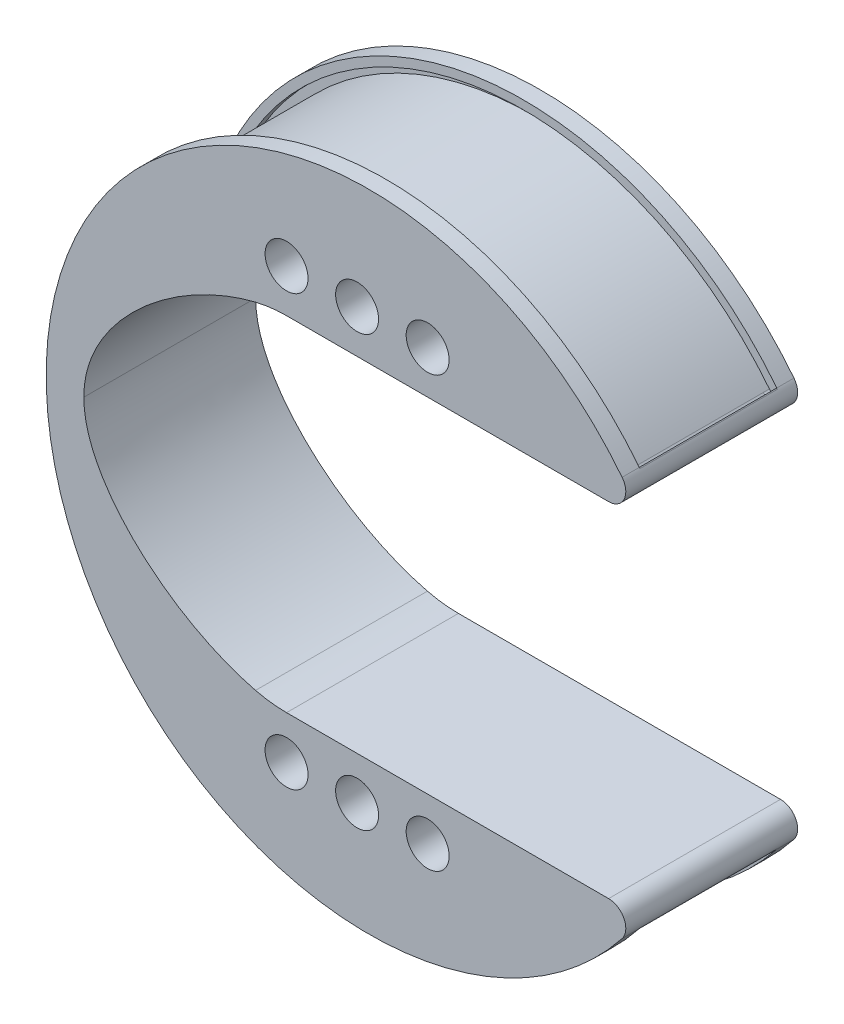
ISO-10303-21;
HEADER;
FILE_DESCRIPTION(('STEP AP214'),'2;1');
FILE_NAME('part.step','',(''),(''),'','','');
FILE_SCHEMA(('AUTOMOTIVE_DESIGN { 1 0 10303 214 1 1 1 1 }'));
ENDSEC;
DATA;
#1=APPLICATION_CONTEXT('core data for automotive mechanical design processes');
#2=APPLICATION_PROTOCOL_DEFINITION('international standard','automotive_design',2000,#1);
#3=PRODUCT_CONTEXT('',#1,'mechanical');
#4=PRODUCT('Part','Part','',(#3));
#5=PRODUCT_RELATED_PRODUCT_CATEGORY('part','',(#4));
#6=PRODUCT_DEFINITION_FORMATION('','',#4);
#7=PRODUCT_DEFINITION_CONTEXT('part definition',#1,'design');
#8=PRODUCT_DEFINITION('design','',#6,#7);
#9=PRODUCT_DEFINITION_SHAPE('','',#8);
#10=(LENGTH_UNIT() NAMED_UNIT(*) SI_UNIT(.MILLI.,.METRE.));
#11=(NAMED_UNIT(*) PLANE_ANGLE_UNIT() SI_UNIT($,.RADIAN.));
#12=(NAMED_UNIT(*) SI_UNIT($,.STERADIAN.) SOLID_ANGLE_UNIT());
#13=UNCERTAINTY_MEASURE_WITH_UNIT(LENGTH_MEASURE(1.E-05),#10,'distance_accuracy_value','');
#14=(GEOMETRIC_REPRESENTATION_CONTEXT(3) GLOBAL_UNCERTAINTY_ASSIGNED_CONTEXT((#13)) GLOBAL_UNIT_ASSIGNED_CONTEXT((#10,
#11,#12)) REPRESENTATION_CONTEXT('',''));
#15=CARTESIAN_POINT('',(0.,0.,0.));
#16=DIRECTION('',(0.,0.,1.));
#17=DIRECTION('',(1.,0.,0.));
#18=AXIS2_PLACEMENT_3D('',#15,#16,#17);
#19=CARTESIAN_POINT('',(33.1482051209383,0.,0.));
#20=DIRECTION('',(0.,0.,1.));
#21=DIRECTION('',(1.,0.,0.));
#22=AXIS2_PLACEMENT_3D('',#19,#20,#21);
#23=CYLINDRICAL_SURFACE('',#22,37.5360003662905);
#24=CARTESIAN_POINT('',(33.1482051209383,0.,2.));
#25=DIRECTION('',(0.,0.,1.));
#26=DIRECTION('',(1.,0.,0.));
#27=AXIS2_PLACEMENT_3D('',#24,#25,#26);
#28=CIRCLE('',#27,37.5360003662905);
#29=CARTESIAN_POINT('',(62.6259639896768,23.2381809867871,2.));
#30=VERTEX_POINT('',#29);
#31=CARTESIAN_POINT('',(62.6259639896767,-23.2381809867871,2.));
#32=VERTEX_POINT('',#31);
#33=EDGE_CURVE('E261',#30,#32,#28,.T.);
#34=ORIENTED_EDGE('',*,*,#33,.F.);
#35=DIRECTION('',(0.,0.,1.));
#36=VECTOR('',#35,1.);
#37=CARTESIAN_POINT('',(62.6259639896768,23.2381809867871,0.));
#38=LINE('',#37,#36);
#39=CARTESIAN_POINT('',(62.6259639896768,23.2381809867871,0.));
#40=VERTEX_POINT('',#39);
#41=EDGE_CURVE('E466',#30,#40,#38,.F.);
#42=ORIENTED_EDGE('',*,*,#41,.T.);
#43=CARTESIAN_POINT('',(33.1482051209383,0.,0.));
#44=DIRECTION('',(0.,0.,1.));
#45=DIRECTION('',(1.,0.,0.));
#46=AXIS2_PLACEMENT_3D('',#43,#44,#45);
#47=CIRCLE('',#46,37.5360003662905);
#48=CARTESIAN_POINT('',(62.6259639896767,-23.2381809867871,0.));
#49=VERTEX_POINT('',#48);
#50=EDGE_CURVE('E286',#49,#40,#47,.F.);
#51=ORIENTED_EDGE('',*,*,#50,.F.);
#52=DIRECTION('',(0.,0.,1.));
#53=VECTOR('',#52,1.);
#54=CARTESIAN_POINT('',(62.6259639896767,-23.2381809867871,0.));
#55=LINE('',#54,#53);
#56=EDGE_CURVE('E471',#49,#32,#55,.T.);
#57=ORIENTED_EDGE('',*,*,#56,.T.);
#58=EDGE_LOOP('',(#34,#42,#51,#57));
#59=FACE_BOUND('',#58,.T.);
#60=ADVANCED_FACE('F77',(#59),#23,.T.);
#61=CARTESIAN_POINT('',(0.,0.,20.));
#62=CARTESIAN_POINT('',(-0.0933459762474879,-8.13219904614453,20.));
#63=CARTESIAN_POINT('',(9.98710230848334,-17.0850852007355,20.));
#64=CARTESIAN_POINT('',(19.9745764255448,-19.5597289191086,20.));
#65=B_SPLINE_CURVE_WITH_KNOTS('',3,(#61,#62,#63,#64),.UNSPECIFIED.,.F.,.F.,(4,4),(0.,1.),.UNSPECIFIED.);
#66=DIRECTION('',(0.,0.,-1.));
#67=VECTOR('',#66,1.);
#68=SURFACE_OF_LINEAR_EXTRUSION('',#65,#67);
#69=CARTESIAN_POINT('',(0.,0.,0.));
#70=CARTESIAN_POINT('',(-0.0933459762474879,-8.13219904614453,0.));
#71=CARTESIAN_POINT('',(9.98710230848334,-17.0850852007355,0.));
#72=CARTESIAN_POINT('',(19.9745764255448,-19.5597289191086,0.));
#73=B_SPLINE_CURVE_WITH_KNOTS('',3,(#69,#70,#71,#72),.UNSPECIFIED.,.F.,.F.,(4,4),(0.,1.),.UNSPECIFIED.);
#74=CARTESIAN_POINT('',(0.,0.,0.));
#75=VERTEX_POINT('',#74);
#76=CARTESIAN_POINT('',(19.9745764255448,-19.5597289191086,0.));
#77=VERTEX_POINT('',#76);
#78=EDGE_CURVE('E289',#75,#77,#73,.T.);
#79=ORIENTED_EDGE('',*,*,#78,.F.);
#80=DIRECTION('',(0.,0.,-1.));
#81=VECTOR('',#80,1.);
#82=CARTESIAN_POINT('',(0.,0.,20.));
#83=LINE('',#82,#81);
#84=CARTESIAN_POINT('',(0.,0.,20.));
#85=VERTEX_POINT('',#84);
#86=EDGE_CURVE('E446',#85,#75,#83,.T.);
#87=ORIENTED_EDGE('',*,*,#86,.F.);
#88=CARTESIAN_POINT('',(19.9745764255448,-19.5597289191086,20.));
#89=VERTEX_POINT('',#88);
#90=EDGE_CURVE('E292',#85,#89,#65,.T.);
#91=ORIENTED_EDGE('',*,*,#90,.T.);
#92=DIRECTION('',(0.,0.,-1.));
#93=VECTOR('',#92,1.);
#94=CARTESIAN_POINT('',(19.9745764255448,-19.5597289191086,20.));
#95=LINE('',#94,#93);
#96=EDGE_CURVE('E441',#89,#77,#95,.T.);
#97=ORIENTED_EDGE('',*,*,#96,.T.);
#98=EDGE_LOOP('',(#79,#87,#91,#97));
#99=FACE_BOUND('',#98,.T.);
#100=ADVANCED_FACE('F308',(#99),#68,.T.);
#101=CARTESIAN_POINT('',(0.,0.,20.));
#102=CARTESIAN_POINT('',(-0.0933459762474879,8.13219904614453,20.));
#103=CARTESIAN_POINT('',(9.98710230848334,17.0850852007355,20.));
#104=CARTESIAN_POINT('',(19.9745764255448,19.5597289191086,20.));
#105=B_SPLINE_CURVE_WITH_KNOTS('',3,(#101,#102,#103,#104),.UNSPECIFIED.,.F.,.F.,(4,4),(0.,1.),.UNSPECIFIED.);
#106=DIRECTION('',(0.,0.,-1.));
#107=VECTOR('',#106,1.);
#108=SURFACE_OF_LINEAR_EXTRUSION('',#105,#107);
#109=CARTESIAN_POINT('',(0.,0.,0.));
#110=CARTESIAN_POINT('',(-0.0933459762474879,8.13219904614453,0.));
#111=CARTESIAN_POINT('',(9.98710230848334,17.0850852007355,0.));
#112=CARTESIAN_POINT('',(19.9745764255448,19.5597289191086,0.));
#113=B_SPLINE_CURVE_WITH_KNOTS('',3,(#109,#110,#111,#112),.UNSPECIFIED.,.F.,.F.,(4,4),(0.,1.),.UNSPECIFIED.);
#114=CARTESIAN_POINT('',(19.9745764255448,19.5597289191086,0.));
#115=VERTEX_POINT('',#114);
#116=EDGE_CURVE('E422',#75,#115,#113,.T.);
#117=ORIENTED_EDGE('',*,*,#116,.T.);
#118=DIRECTION('',(0.,0.,-1.));
#119=VECTOR('',#118,1.);
#120=CARTESIAN_POINT('',(19.9745764255448,19.5597289191086,20.));
#121=LINE('',#120,#119);
#122=CARTESIAN_POINT('',(19.9745764255448,19.5597289191086,20.));
#123=VERTEX_POINT('',#122);
#124=EDGE_CURVE('E418',#123,#115,#121,.T.);
#125=ORIENTED_EDGE('',*,*,#124,.F.);
#126=EDGE_CURVE('E298',#85,#123,#105,.T.);
#127=ORIENTED_EDGE('',*,*,#126,.F.);
#128=ORIENTED_EDGE('',*,*,#86,.T.);
#129=EDGE_LOOP('',(#117,#125,#127,#128));
#130=FACE_BOUND('',#129,.T.);
#131=ADVANCED_FACE('F311',(#130),#108,.F.);
#132=CARTESIAN_POINT('',(23.5821093501447,5.,20.));
#133=DIRECTION('',(0.,0.,-1.));
#134=DIRECTION('',(-1.,0.,0.));
#135=AXIS2_PLACEMENT_3D('',#132,#133,#134);
#136=CYLINDRICAL_SURFACE('',#135,15.);
#137=CARTESIAN_POINT('',(23.5821093501447,5.,0.));
#138=DIRECTION('',(0.,0.,1.));
#139=DIRECTION('',(1.,0.,0.));
#140=AXIS2_PLACEMENT_3D('',#137,#138,#139);
#141=CIRCLE('',#140,15.);
#142=CARTESIAN_POINT('',(23.5821093501447,20.,0.));
#143=VERTEX_POINT('',#142);
#144=EDGE_CURVE('E412',#115,#143,#141,.F.);
#145=ORIENTED_EDGE('',*,*,#144,.T.);
#146=DIRECTION('',(0.,0.,-1.));
#147=VECTOR('',#146,1.);
#148=CARTESIAN_POINT('',(23.5821093501447,20.,20.));
#149=LINE('',#148,#147);
#150=CARTESIAN_POINT('',(23.5821093501447,20.,20.));
#151=VERTEX_POINT('',#150);
#152=EDGE_CURVE('E415',#151,#143,#149,.T.);
#153=ORIENTED_EDGE('',*,*,#152,.F.);
#154=CARTESIAN_POINT('',(23.5821093501447,5.,20.));
#155=DIRECTION('',(0.,0.,1.));
#156=DIRECTION('',(1.,0.,0.));
#157=AXIS2_PLACEMENT_3D('',#154,#155,#156);
#158=CIRCLE('',#157,15.);
#159=EDGE_CURVE('E508',#123,#151,#158,.F.);
#160=ORIENTED_EDGE('',*,*,#159,.F.);
#161=ORIENTED_EDGE('',*,*,#124,.T.);
#162=EDGE_LOOP('',(#145,#153,#160,#161));
#163=FACE_BOUND('',#162,.T.);
#164=ADVANCED_FACE('F401',(#163),#136,.F.);
#165=CARTESIAN_POINT('',(0.,20.,20.));
#166=DIRECTION('',(0.,1.,0.));
#167=DIRECTION('',(0.,0.,1.));
#168=AXIS2_PLACEMENT_3D('',#165,#166,#167);
#169=PLANE('',#168);
#170=DIRECTION('',(1.,0.,0.));
#171=VECTOR('',#170,1.);
#172=CARTESIAN_POINT('',(0.,20.,0.));
#173=LINE('',#172,#171);
#174=CARTESIAN_POINT('',(61.0553246790905,20.,0.));
#175=VERTEX_POINT('',#174);
#176=EDGE_CURVE('E421',#143,#175,#173,.T.);
#177=ORIENTED_EDGE('',*,*,#176,.T.);
#178=DIRECTION('',(0.,0.,1.));
#179=VECTOR('',#178,1.);
#180=CARTESIAN_POINT('',(61.0553246790905,20.,20.));
#181=LINE('',#180,#179);
#182=CARTESIAN_POINT('',(61.0553246790905,20.,20.));
#183=VERTEX_POINT('',#182);
#184=EDGE_CURVE('E483',#175,#183,#181,.T.);
#185=ORIENTED_EDGE('',*,*,#184,.T.);
#186=DIRECTION('',(1.,0.,0.));
#187=VECTOR('',#186,1.);
#188=CARTESIAN_POINT('',(0.,20.,20.));
#189=LINE('',#188,#187);
#190=EDGE_CURVE('E428',#151,#183,#189,.T.);
#191=ORIENTED_EDGE('',*,*,#190,.F.);
#192=ORIENTED_EDGE('',*,*,#152,.T.);
#193=EDGE_LOOP('',(#177,#185,#191,#192));
#194=FACE_BOUND('',#193,.T.);
#195=ADVANCED_FACE('F398',(#194),#169,.F.);
#196=CARTESIAN_POINT('',(0.,-20.,20.));
#197=DIRECTION('',(0.,1.,0.));
#198=DIRECTION('',(0.,0.,1.));
#199=AXIS2_PLACEMENT_3D('',#196,#197,#198);
#200=PLANE('',#199);
#201=DIRECTION('',(1.,0.,0.));
#202=VECTOR('',#201,1.);
#203=CARTESIAN_POINT('',(0.,-20.,20.));
#204=LINE('',#203,#202);
#205=CARTESIAN_POINT('',(23.5821093501447,-20.,20.));
#206=VERTEX_POINT('',#205);
#207=CARTESIAN_POINT('',(61.0553246790905,-20.,20.));
#208=VERTEX_POINT('',#207);
#209=EDGE_CURVE('E509',#206,#208,#204,.T.);
#210=ORIENTED_EDGE('',*,*,#209,.T.);
#211=DIRECTION('',(0.,0.,-1.));
#212=VECTOR('',#211,1.);
#213=CARTESIAN_POINT('',(61.0553246790905,-20.,0.));
#214=LINE('',#213,#212);
#215=CARTESIAN_POINT('',(61.0553246790905,-20.,0.));
#216=VERTEX_POINT('',#215);
#217=EDGE_CURVE('E478',#208,#216,#214,.T.);
#218=ORIENTED_EDGE('',*,*,#217,.T.);
#219=DIRECTION('',(1.,0.,0.));
#220=VECTOR('',#219,1.);
#221=CARTESIAN_POINT('',(0.,-20.,0.));
#222=LINE('',#221,#220);
#223=CARTESIAN_POINT('',(23.5821093501447,-20.,0.));
#224=VERTEX_POINT('',#223);
#225=EDGE_CURVE('E434',#224,#216,#222,.T.);
#226=ORIENTED_EDGE('',*,*,#225,.F.);
#227=DIRECTION('',(0.,0.,-1.));
#228=VECTOR('',#227,1.);
#229=CARTESIAN_POINT('',(23.5821093501447,-20.,20.));
#230=LINE('',#229,#228);
#231=EDGE_CURVE('E429',#206,#224,#230,.T.);
#232=ORIENTED_EDGE('',*,*,#231,.F.);
#233=EDGE_LOOP('',(#210,#218,#226,#232));
#234=FACE_BOUND('',#233,.T.);
#235=ADVANCED_FACE('F376',(#234),#200,.T.);
#236=CARTESIAN_POINT('',(31.7910546750724,25.,20.));
#237=DIRECTION('',(0.,0.,-1.));
#238=DIRECTION('',(-1.,0.,0.));
#239=AXIS2_PLACEMENT_3D('',#236,#237,#238);
#240=CYLINDRICAL_SURFACE('',#239,2.5);
#241=CARTESIAN_POINT('',(31.7910546750724,25.,15.));
#242=DIRECTION('',(0.,0.,1.));
#243=DIRECTION('',(1.,0.,0.));
#244=AXIS2_PLACEMENT_3D('',#241,#242,#243);
#245=CIRCLE('',#244,2.5);
#246=CARTESIAN_POINT('',(34.2910546750724,25.,15.));
#247=VERTEX_POINT('',#246);
#248=EDGE_CURVE('E451',#247,#247,#245,.T.);
#249=ORIENTED_EDGE('',*,*,#248,.F.);
#250=EDGE_LOOP('',(#249));
#251=FACE_BOUND('',#250,.T.);
#252=CARTESIAN_POINT('',(31.7910546750724,25.,20.));
#253=DIRECTION('',(0.,0.,1.));
#254=DIRECTION('',(1.,0.,0.));
#255=AXIS2_PLACEMENT_3D('',#252,#253,#254);
#256=CIRCLE('',#255,2.5);
#257=CARTESIAN_POINT('',(34.2910546750724,25.,20.));
#258=VERTEX_POINT('',#257);
#259=EDGE_CURVE('E529',#258,#258,#256,.T.);
#260=ORIENTED_EDGE('',*,*,#259,.T.);
#261=EDGE_LOOP('',(#260));
#262=FACE_BOUND('',#261,.T.);
#263=ADVANCED_FACE('F372',(#251,#262),#240,.F.);
#264=CARTESIAN_POINT('',(23.5821093501447,25.,20.));
#265=DIRECTION('',(0.,0.,-1.));
#266=DIRECTION('',(-1.,0.,0.));
#267=AXIS2_PLACEMENT_3D('',#264,#265,#266);
#268=CYLINDRICAL_SURFACE('',#267,2.5);
#269=CARTESIAN_POINT('',(23.5821093501447,25.,15.));
#270=DIRECTION('',(0.,0.,1.));
#271=DIRECTION('',(1.,0.,0.));
#272=AXIS2_PLACEMENT_3D('',#269,#270,#271);
#273=CIRCLE('',#272,2.5);
#274=CARTESIAN_POINT('',(26.0821093501447,25.,15.));
#275=VERTEX_POINT('',#274);
#276=EDGE_CURVE('E448',#275,#275,#273,.T.);
#277=ORIENTED_EDGE('',*,*,#276,.F.);
#278=EDGE_LOOP('',(#277));
#279=FACE_BOUND('',#278,.T.);
#280=CARTESIAN_POINT('',(23.5821093501447,25.,20.));
#281=DIRECTION('',(0.,0.,1.));
#282=DIRECTION('',(1.,0.,0.));
#283=AXIS2_PLACEMENT_3D('',#280,#281,#282);
#284=CIRCLE('',#283,2.5);
#285=CARTESIAN_POINT('',(26.0821093501447,25.,20.));
#286=VERTEX_POINT('',#285);
#287=EDGE_CURVE('E526',#286,#286,#284,.T.);
#288=ORIENTED_EDGE('',*,*,#287,.T.);
#289=EDGE_LOOP('',(#288));
#290=FACE_BOUND('',#289,.T.);
#291=ADVANCED_FACE('F375',(#279,#290),#268,.F.);
#292=CARTESIAN_POINT('',(40.,-25.,20.));
#293=DIRECTION('',(0.,0.,-1.));
#294=DIRECTION('',(-1.,0.,0.));
#295=AXIS2_PLACEMENT_3D('',#292,#293,#294);
#296=CYLINDRICAL_SURFACE('',#295,2.5);
#297=CARTESIAN_POINT('',(40.,-25.,15.));
#298=DIRECTION('',(0.,0.,1.));
#299=DIRECTION('',(1.,0.,0.));
#300=AXIS2_PLACEMENT_3D('',#297,#298,#299);
#301=CIRCLE('',#300,2.5);
#302=CARTESIAN_POINT('',(42.5,-25.,15.));
#303=VERTEX_POINT('',#302);
#304=EDGE_CURVE('E463',#303,#303,#301,.T.);
#305=ORIENTED_EDGE('',*,*,#304,.F.);
#306=EDGE_LOOP('',(#305));
#307=FACE_BOUND('',#306,.T.);
#308=CARTESIAN_POINT('',(40.,-25.,20.));
#309=DIRECTION('',(0.,0.,1.));
#310=DIRECTION('',(1.,0.,0.));
#311=AXIS2_PLACEMENT_3D('',#308,#309,#310);
#312=CIRCLE('',#311,2.5);
#313=CARTESIAN_POINT('',(42.5,-25.,20.));
#314=VERTEX_POINT('',#313);
#315=EDGE_CURVE('E523',#314,#314,#312,.T.);
#316=ORIENTED_EDGE('',*,*,#315,.T.);
#317=EDGE_LOOP('',(#316));
#318=FACE_BOUND('',#317,.T.);
#319=ADVANCED_FACE('F380',(#307,#318),#296,.F.);
#320=CARTESIAN_POINT('',(31.7910546750724,-25.,20.));
#321=DIRECTION('',(0.,0.,-1.));
#322=DIRECTION('',(-1.,0.,0.));
#323=AXIS2_PLACEMENT_3D('',#320,#321,#322);
#324=CYLINDRICAL_SURFACE('',#323,2.5);
#325=CARTESIAN_POINT('',(31.7910546750724,-25.,15.));
#326=DIRECTION('',(0.,0.,1.));
#327=DIRECTION('',(1.,0.,0.));
#328=AXIS2_PLACEMENT_3D('',#325,#326,#327);
#329=CIRCLE('',#328,2.5);
#330=CARTESIAN_POINT('',(34.2910546750724,-25.,15.));
#331=VERTEX_POINT('',#330);
#332=EDGE_CURVE('E460',#331,#331,#329,.T.);
#333=ORIENTED_EDGE('',*,*,#332,.F.);
#334=EDGE_LOOP('',(#333));
#335=FACE_BOUND('',#334,.T.);
#336=CARTESIAN_POINT('',(31.7910546750724,-25.,20.));
#337=DIRECTION('',(0.,0.,1.));
#338=DIRECTION('',(1.,0.,0.));
#339=AXIS2_PLACEMENT_3D('',#336,#337,#338);
#340=CIRCLE('',#339,2.5);
#341=CARTESIAN_POINT('',(34.2910546750724,-25.,20.));
#342=VERTEX_POINT('',#341);
#343=EDGE_CURVE('E520',#342,#342,#340,.T.);
#344=ORIENTED_EDGE('',*,*,#343,.T.);
#345=EDGE_LOOP('',(#344));
#346=FACE_BOUND('',#345,.T.);
#347=ADVANCED_FACE('F384',(#335,#346),#324,.F.);
#348=CARTESIAN_POINT('',(23.5821093501447,-25.,20.));
#349=DIRECTION('',(0.,0.,-1.));
#350=DIRECTION('',(-1.,0.,0.));
#351=AXIS2_PLACEMENT_3D('',#348,#349,#350);
#352=CYLINDRICAL_SURFACE('',#351,2.5);
#353=CARTESIAN_POINT('',(23.5821093501447,-25.,15.));
#354=DIRECTION('',(0.,0.,1.));
#355=DIRECTION('',(1.,0.,0.));
#356=AXIS2_PLACEMENT_3D('',#353,#354,#355);
#357=CIRCLE('',#356,2.5);
#358=CARTESIAN_POINT('',(26.0821093501447,-25.,15.));
#359=VERTEX_POINT('',#358);
#360=EDGE_CURVE('E457',#359,#359,#357,.T.);
#361=ORIENTED_EDGE('',*,*,#360,.F.);
#362=EDGE_LOOP('',(#361));
#363=FACE_BOUND('',#362,.T.);
#364=CARTESIAN_POINT('',(23.5821093501447,-25.,20.));
#365=DIRECTION('',(0.,0.,1.));
#366=DIRECTION('',(1.,0.,0.));
#367=AXIS2_PLACEMENT_3D('',#364,#365,#366);
#368=CIRCLE('',#367,2.5);
#369=CARTESIAN_POINT('',(26.0821093501447,-25.,20.));
#370=VERTEX_POINT('',#369);
#371=EDGE_CURVE('E517',#370,#370,#368,.T.);
#372=ORIENTED_EDGE('',*,*,#371,.T.);
#373=EDGE_LOOP('',(#372));
#374=FACE_BOUND('',#373,.T.);
#375=ADVANCED_FACE('F388',(#363,#374),#352,.F.);
#376=CARTESIAN_POINT('',(23.5821093501447,-5.,20.));
#377=DIRECTION('',(0.,0.,-1.));
#378=DIRECTION('',(-1.,0.,0.));
#379=AXIS2_PLACEMENT_3D('',#376,#377,#378);
#380=CYLINDRICAL_SURFACE('',#379,15.);
#381=CARTESIAN_POINT('',(23.5821093501447,-5.,0.));
#382=DIRECTION('',(0.,0.,1.));
#383=DIRECTION('',(1.,0.,0.));
#384=AXIS2_PLACEMENT_3D('',#381,#382,#383);
#385=CIRCLE('',#384,15.);
#386=EDGE_CURVE('E299',#77,#224,#385,.T.);
#387=ORIENTED_EDGE('',*,*,#386,.F.);
#388=ORIENTED_EDGE('',*,*,#96,.F.);
#389=CARTESIAN_POINT('',(23.5821093501447,-5.,20.));
#390=DIRECTION('',(0.,0.,1.));
#391=DIRECTION('',(1.,0.,0.));
#392=AXIS2_PLACEMENT_3D('',#389,#390,#391);
#393=CIRCLE('',#392,15.);
#394=EDGE_CURVE('E512',#89,#206,#393,.T.);
#395=ORIENTED_EDGE('',*,*,#394,.T.);
#396=ORIENTED_EDGE('',*,*,#231,.T.);
#397=EDGE_LOOP('',(#387,#388,#395,#396));
#398=FACE_BOUND('',#397,.T.);
#399=ADVANCED_FACE('F370',(#398),#380,.F.);
#400=CARTESIAN_POINT('',(40.,25.,20.));
#401=DIRECTION('',(0.,0.,-1.));
#402=DIRECTION('',(-1.,0.,0.));
#403=AXIS2_PLACEMENT_3D('',#400,#401,#402);
#404=CYLINDRICAL_SURFACE('',#403,2.5);
#405=CARTESIAN_POINT('',(40.,25.,15.));
#406=DIRECTION('',(0.,0.,1.));
#407=DIRECTION('',(1.,0.,0.));
#408=AXIS2_PLACEMENT_3D('',#405,#406,#407);
#409=CIRCLE('',#408,2.5);
#410=CARTESIAN_POINT('',(42.5,25.,15.));
#411=VERTEX_POINT('',#410);
#412=EDGE_CURVE('E454',#411,#411,#409,.T.);
#413=ORIENTED_EDGE('',*,*,#412,.F.);
#414=EDGE_LOOP('',(#413));
#415=FACE_BOUND('',#414,.T.);
#416=CARTESIAN_POINT('',(40.,25.,20.));
#417=DIRECTION('',(0.,0.,1.));
#418=DIRECTION('',(1.,0.,0.));
#419=AXIS2_PLACEMENT_3D('',#416,#417,#418);
#420=CIRCLE('',#419,2.5);
#421=CARTESIAN_POINT('',(42.5,25.,20.));
#422=VERTEX_POINT('',#421);
#423=EDGE_CURVE('E443',#422,#422,#420,.T.);
#424=ORIENTED_EDGE('',*,*,#423,.T.);
#425=EDGE_LOOP('',(#424));
#426=FACE_BOUND('',#425,.T.);
#427=ADVANCED_FACE('F363',(#415,#426),#404,.F.);
#428=CARTESIAN_POINT('',(0.,0.,20.));
#429=DIRECTION('',(0.,0.,1.));
#430=DIRECTION('',(1.,0.,0.));
#431=AXIS2_PLACEMENT_3D('',#428,#429,#430);
#432=PLANE('',#431);
#433=CARTESIAN_POINT('',(33.1482051209383,0.,20.));
#434=DIRECTION('',(0.,0.,1.));
#435=DIRECTION('',(1.,0.,0.));
#436=AXIS2_PLACEMENT_3D('',#433,#434,#435);
#437=CIRCLE('',#436,37.5360003662905);
#438=CARTESIAN_POINT('',(62.6259639896767,-23.2381809867871,20.));
#439=VERTEX_POINT('',#438);
#440=CARTESIAN_POINT('',(62.6259639896768,23.2381809867871,20.));
#441=VERTEX_POINT('',#440);
#442=EDGE_CURVE('E278',#439,#441,#437,.F.);
#443=ORIENTED_EDGE('',*,*,#442,.F.);
#444=CARTESIAN_POINT('',(61.0553246790905,-22.,20.));
#445=DIRECTION('',(0.,0.,1.));
#446=DIRECTION('',(1.,0.,0.));
#447=AXIS2_PLACEMENT_3D('',#444,#445,#446);
#448=CIRCLE('',#447,2.);
#449=EDGE_CURVE('E476',#439,#208,#448,.T.);
#450=ORIENTED_EDGE('',*,*,#449,.T.);
#451=ORIENTED_EDGE('',*,*,#209,.F.);
#452=ORIENTED_EDGE('',*,*,#394,.F.);
#453=ORIENTED_EDGE('',*,*,#90,.F.);
#454=ORIENTED_EDGE('',*,*,#126,.T.);
#455=ORIENTED_EDGE('',*,*,#159,.T.);
#456=ORIENTED_EDGE('',*,*,#190,.T.);
#457=CARTESIAN_POINT('',(61.0553246790905,22.,20.));
#458=DIRECTION('',(0.,0.,1.));
#459=DIRECTION('',(1.,0.,0.));
#460=AXIS2_PLACEMENT_3D('',#457,#458,#459);
#461=CIRCLE('',#460,2.);
#462=EDGE_CURVE('E474',#183,#441,#461,.T.);
#463=ORIENTED_EDGE('',*,*,#462,.T.);
#464=EDGE_LOOP('',(#443,#450,#451,#452,#453,#454,#455,#456,#463));
#465=FACE_BOUND('',#464,.T.);
#466=ORIENTED_EDGE('',*,*,#371,.F.);
#467=EDGE_LOOP('',(#466));
#468=FACE_BOUND('',#467,.T.);
#469=ORIENTED_EDGE('',*,*,#343,.F.);
#470=EDGE_LOOP('',(#469));
#471=FACE_BOUND('',#470,.T.);
#472=ORIENTED_EDGE('',*,*,#315,.F.);
#473=EDGE_LOOP('',(#472));
#474=FACE_BOUND('',#473,.T.);
#475=ORIENTED_EDGE('',*,*,#287,.F.);
#476=EDGE_LOOP('',(#475));
#477=FACE_BOUND('',#476,.T.);
#478=ORIENTED_EDGE('',*,*,#259,.F.);
#479=EDGE_LOOP('',(#478));
#480=FACE_BOUND('',#479,.T.);
#481=ORIENTED_EDGE('',*,*,#423,.F.);
#482=EDGE_LOOP('',(#481));
#483=FACE_BOUND('',#482,.T.);
#484=ADVANCED_FACE('F360',(#465,#468,#471,#474,#477,#480,#483),#432,.T.);
#485=CARTESIAN_POINT('',(0.,0.,0.));
#486=DIRECTION('',(0.,0.,1.));
#487=DIRECTION('',(1.,0.,0.));
#488=AXIS2_PLACEMENT_3D('',#485,#486,#487);
#489=PLANE('',#488);
#490=ORIENTED_EDGE('',*,*,#225,.T.);
#491=CARTESIAN_POINT('',(61.0553246790905,-22.,0.));
#492=DIRECTION('',(0.,0.,1.));
#493=DIRECTION('',(1.,0.,0.));
#494=AXIS2_PLACEMENT_3D('',#491,#492,#493);
#495=CIRCLE('',#494,2.);
#496=EDGE_CURVE('E481',#216,#49,#495,.F.);
#497=ORIENTED_EDGE('',*,*,#496,.T.);
#498=ORIENTED_EDGE('',*,*,#50,.T.);
#499=CARTESIAN_POINT('',(61.0553246790905,22.,0.));
#500=DIRECTION('',(0.,0.,1.));
#501=DIRECTION('',(1.,0.,0.));
#502=AXIS2_PLACEMENT_3D('',#499,#500,#501);
#503=CIRCLE('',#502,2.);
#504=EDGE_CURVE('E433',#40,#175,#503,.F.);
#505=ORIENTED_EDGE('',*,*,#504,.T.);
#506=ORIENTED_EDGE('',*,*,#176,.F.);
#507=ORIENTED_EDGE('',*,*,#144,.F.);
#508=ORIENTED_EDGE('',*,*,#116,.F.);
#509=ORIENTED_EDGE('',*,*,#78,.T.);
#510=ORIENTED_EDGE('',*,*,#386,.T.);
#511=EDGE_LOOP('',(#490,#497,#498,#505,#506,#507,#508,#509,#510));
#512=FACE_BOUND('',#511,.T.);
#513=ADVANCED_FACE('F358',(#512),#489,.F.);
#514=CARTESIAN_POINT('',(23.5821093501447,25.,15.));
#515=DIRECTION('',(0.,0.,1.));
#516=DIRECTION('',(1.,0.,0.));
#517=AXIS2_PLACEMENT_3D('',#514,#515,#516);
#518=PLANE('',#517);
#519=ORIENTED_EDGE('',*,*,#276,.T.);
#520=EDGE_LOOP('',(#519));
#521=FACE_BOUND('',#520,.T.);
#522=ADVANCED_FACE('F354',(#521),#518,.T.);
#523=CARTESIAN_POINT('',(31.7910546750724,25.,15.));
#524=DIRECTION('',(0.,0.,1.));
#525=DIRECTION('',(1.,0.,0.));
#526=AXIS2_PLACEMENT_3D('',#523,#524,#525);
#527=PLANE('',#526);
#528=ORIENTED_EDGE('',*,*,#248,.T.);
#529=EDGE_LOOP('',(#528));
#530=FACE_BOUND('',#529,.T.);
#531=ADVANCED_FACE('F350',(#530),#527,.T.);
#532=CARTESIAN_POINT('',(40.,25.,15.));
#533=DIRECTION('',(0.,0.,1.));
#534=DIRECTION('',(1.,0.,0.));
#535=AXIS2_PLACEMENT_3D('',#532,#533,#534);
#536=PLANE('',#535);
#537=ORIENTED_EDGE('',*,*,#412,.T.);
#538=EDGE_LOOP('',(#537));
#539=FACE_BOUND('',#538,.T.);
#540=ADVANCED_FACE('F346',(#539),#536,.T.);
#541=CARTESIAN_POINT('',(23.5821093501447,-25.,15.));
#542=DIRECTION('',(0.,0.,1.));
#543=DIRECTION('',(1.,0.,0.));
#544=AXIS2_PLACEMENT_3D('',#541,#542,#543);
#545=PLANE('',#544);
#546=ORIENTED_EDGE('',*,*,#360,.T.);
#547=EDGE_LOOP('',(#546));
#548=FACE_BOUND('',#547,.T.);
#549=ADVANCED_FACE('F342',(#548),#545,.T.);
#550=CARTESIAN_POINT('',(31.7910546750724,-25.,15.));
#551=DIRECTION('',(0.,0.,1.));
#552=DIRECTION('',(1.,0.,0.));
#553=AXIS2_PLACEMENT_3D('',#550,#551,#552);
#554=PLANE('',#553);
#555=ORIENTED_EDGE('',*,*,#332,.T.);
#556=EDGE_LOOP('',(#555));
#557=FACE_BOUND('',#556,.T.);
#558=ADVANCED_FACE('F338',(#557),#554,.T.);
#559=CARTESIAN_POINT('',(40.,-25.,15.));
#560=DIRECTION('',(0.,0.,1.));
#561=DIRECTION('',(1.,0.,0.));
#562=AXIS2_PLACEMENT_3D('',#559,#560,#561);
#563=PLANE('',#562);
#564=ORIENTED_EDGE('',*,*,#304,.T.);
#565=EDGE_LOOP('',(#564));
#566=FACE_BOUND('',#565,.T.);
#567=ADVANCED_FACE('F324',(#566),#563,.T.);
#568=CARTESIAN_POINT('',(62.6259639896768,23.2381809867871,18.));
#569=VERTEX_POINT('',#568);
#570=EDGE_CURVE('E467',#441,#569,#38,.F.);
#571=ORIENTED_EDGE('',*,*,#570,.T.);
#572=CARTESIAN_POINT('',(33.1482051209383,0.,18.));
#573=DIRECTION('',(0.,0.,1.));
#574=DIRECTION('',(1.,0.,0.));
#575=AXIS2_PLACEMENT_3D('',#572,#573,#574);
#576=CIRCLE('',#575,37.5360003662905);
#577=CARTESIAN_POINT('',(62.6259639896767,-23.2381809867871,18.));
#578=VERTEX_POINT('',#577);
#579=EDGE_CURVE('E270',#569,#578,#576,.T.);
#580=ORIENTED_EDGE('',*,*,#579,.T.);
#581=EDGE_CURVE('E470',#578,#439,#55,.T.);
#582=ORIENTED_EDGE('',*,*,#581,.T.);
#583=ORIENTED_EDGE('',*,*,#442,.T.);
#584=EDGE_LOOP('',(#571,#580,#582,#583));
#585=FACE_BOUND('',#584,.T.);
#586=ADVANCED_FACE('F316',(#585),#23,.T.);
#587=CARTESIAN_POINT('',(61.0553246790905,-22.,0.));
#588=DIRECTION('',(0.,0.,1.));
#589=DIRECTION('',(1.,0.,0.));
#590=AXIS2_PLACEMENT_3D('',#587,#588,#589);
#591=CYLINDRICAL_SURFACE('',#590,2.);
#592=ORIENTED_EDGE('',*,*,#496,.F.);
#593=ORIENTED_EDGE('',*,*,#217,.F.);
#594=ORIENTED_EDGE('',*,*,#449,.F.);
#595=ORIENTED_EDGE('',*,*,#581,.F.);
#596=DIRECTION('',(0.,0.,1.));
#597=VECTOR('',#596,1.);
#598=CARTESIAN_POINT('',(62.6259639896767,-23.2381809867871,2.));
#599=LINE('',#598,#597);
#600=EDGE_CURVE('E282',#32,#578,#599,.T.);
#601=ORIENTED_EDGE('',*,*,#600,.F.);
#602=ORIENTED_EDGE('',*,*,#56,.F.);
#603=EDGE_LOOP('',(#592,#593,#594,#595,#601,#602));
#604=FACE_BOUND('',#603,.T.);
#605=ADVANCED_FACE('F314',(#604),#591,.T.);
#606=CARTESIAN_POINT('',(61.0553246790905,22.,0.));
#607=DIRECTION('',(0.,0.,1.));
#608=DIRECTION('',(1.,0.,0.));
#609=AXIS2_PLACEMENT_3D('',#606,#607,#608);
#610=CYLINDRICAL_SURFACE('',#609,2.);
#611=ORIENTED_EDGE('',*,*,#504,.F.);
#612=ORIENTED_EDGE('',*,*,#41,.F.);
#613=DIRECTION('',(0.,0.,1.));
#614=VECTOR('',#613,1.);
#615=CARTESIAN_POINT('',(62.6259639896768,23.2381809867871,2.));
#616=LINE('',#615,#614);
#617=EDGE_CURVE('E268',#30,#569,#616,.T.);
#618=ORIENTED_EDGE('',*,*,#617,.T.);
#619=ORIENTED_EDGE('',*,*,#570,.F.);
#620=ORIENTED_EDGE('',*,*,#462,.F.);
#621=ORIENTED_EDGE('',*,*,#184,.F.);
#622=EDGE_LOOP('',(#611,#612,#618,#619,#620,#621));
#623=FACE_BOUND('',#622,.T.);
#624=ADVANCED_FACE('F79',(#623),#610,.T.);
#625=CARTESIAN_POINT('',(61.8406443343836,22.6190904933935,2.));
#626=DIRECTION('',(0.,0.,1.));
#627=DIRECTION('',(1.,0.,0.));
#628=AXIS2_PLACEMENT_3D('',#625,#626,#627);
#629=CYLINDRICAL_SURFACE('',#628,1.);
#630=CARTESIAN_POINT('',(61.8406443343836,22.6190904933935,18.));
#631=DIRECTION('',(0.,0.,1.));
#632=DIRECTION('',(1.,0.,0.));
#633=AXIS2_PLACEMENT_3D('',#630,#631,#632);
#634=CIRCLE('',#633,1.);
#635=CARTESIAN_POINT('',(61.0553246790905,22.,18.));
#636=VERTEX_POINT('',#635);
#637=EDGE_CURVE('E257',#636,#569,#634,.T.);
#638=ORIENTED_EDGE('',*,*,#637,.T.);
#639=ORIENTED_EDGE('',*,*,#617,.F.);
#640=CARTESIAN_POINT('',(61.8406443343836,22.6190904933935,2.));
#641=DIRECTION('',(0.,0.,1.));
#642=DIRECTION('',(1.,0.,0.));
#643=AXIS2_PLACEMENT_3D('',#640,#641,#642);
#644=CIRCLE('',#643,1.);
#645=CARTESIAN_POINT('',(61.0553246790905,22.,2.));
#646=VERTEX_POINT('',#645);
#647=EDGE_CURVE('E258',#646,#30,#644,.T.);
#648=ORIENTED_EDGE('',*,*,#647,.F.);
#649=DIRECTION('',(0.,0.,1.));
#650=VECTOR('',#649,1.);
#651=CARTESIAN_POINT('',(61.0553246790905,22.,2.));
#652=LINE('',#651,#650);
#653=EDGE_CURVE('E275',#646,#636,#652,.T.);
#654=ORIENTED_EDGE('',*,*,#653,.T.);
#655=EDGE_LOOP('',(#638,#639,#648,#654));
#656=FACE_BOUND('',#655,.T.);
#657=ADVANCED_FACE('F322',(#656),#629,.F.);
#658=CARTESIAN_POINT('',(33.1482051209383,0.,2.));
#659=DIRECTION('',(0.,0.,1.));
#660=DIRECTION('',(1.,0.,0.));
#661=AXIS2_PLACEMENT_3D('',#658,#659,#660);
#662=CYLINDRICAL_SURFACE('',#661,35.5360003662905);
#663=DIRECTION('',(0.,0.,1.));
#664=VECTOR('',#663,1.);
#665=CARTESIAN_POINT('',(61.0553246790905,-22.,2.));
#666=LINE('',#665,#664);
#667=CARTESIAN_POINT('',(61.0553246790905,-22.,2.));
#668=VERTEX_POINT('',#667);
#669=CARTESIAN_POINT('',(61.0553246790905,-22.,18.));
#670=VERTEX_POINT('',#669);
#671=EDGE_CURVE('E279',#668,#670,#666,.T.);
#672=ORIENTED_EDGE('',*,*,#671,.T.);
#673=DIRECTION('',(0.,0.,1.));
#674=VECTOR('',#673,1.);
#675=CARTESIAN_POINT('',(61.0553246790905,-22.,1.));
#676=LINE('',#675,#674);
#677=CARTESIAN_POINT('',(61.0553246790905,-22.,19.));
#678=VERTEX_POINT('',#677);
#679=EDGE_CURVE('E251',#670,#678,#676,.T.);
#680=ORIENTED_EDGE('',*,*,#679,.T.);
#681=CARTESIAN_POINT('',(33.1482051209383,0.,19.));
#682=DIRECTION('',(0.,0.,-1.));
#683=DIRECTION('',(1.,0.,0.));
#684=AXIS2_PLACEMENT_3D('',#681,#682,#683);
#685=CIRCLE('',#684,35.5360003662905);
#686=CARTESIAN_POINT('',(61.0553246790905,22.,19.));
#687=VERTEX_POINT('',#686);
#688=EDGE_CURVE('E229',#678,#687,#685,.T.);
#689=ORIENTED_EDGE('',*,*,#688,.T.);
#690=DIRECTION('',(0.,0.,1.));
#691=VECTOR('',#690,1.);
#692=CARTESIAN_POINT('',(61.0553246790905,22.,1.));
#693=LINE('',#692,#691);
#694=EDGE_CURVE('E247',#636,#687,#693,.T.);
#695=ORIENTED_EDGE('',*,*,#694,.F.);
#696=ORIENTED_EDGE('',*,*,#653,.F.);
#697=CARTESIAN_POINT('',(61.0553246790905,22.,1.));
#698=VERTEX_POINT('',#697);
#699=EDGE_CURVE('E244',#698,#646,#693,.T.);
#700=ORIENTED_EDGE('',*,*,#699,.F.);
#701=CARTESIAN_POINT('',(33.1482051209383,0.,1.));
#702=DIRECTION('',(0.,0.,-1.));
#703=DIRECTION('',(1.,0.,0.));
#704=AXIS2_PLACEMENT_3D('',#701,#702,#703);
#705=CIRCLE('',#704,35.5360003662905);
#706=CARTESIAN_POINT('',(61.0553246790905,-22.,1.));
#707=VERTEX_POINT('',#706);
#708=EDGE_CURVE('E228',#707,#698,#705,.T.);
#709=ORIENTED_EDGE('',*,*,#708,.F.);
#710=EDGE_CURVE('E248',#707,#668,#676,.T.);
#711=ORIENTED_EDGE('',*,*,#710,.T.);
#712=EDGE_LOOP('',(#672,#680,#689,#695,#696,#700,#709,#711));
#713=FACE_BOUND('',#712,.T.);
#714=ADVANCED_FACE('F496',(#713),#662,.T.);
#715=CARTESIAN_POINT('',(61.8406443343836,-22.6190904933936,2.));
#716=DIRECTION('',(0.,0.,1.));
#717=DIRECTION('',(1.,0.,0.));
#718=AXIS2_PLACEMENT_3D('',#715,#716,#717);
#719=CYLINDRICAL_SURFACE('',#718,1.);
#720=CARTESIAN_POINT('',(61.8406443343836,-22.6190904933936,18.));
#721=DIRECTION('',(0.,0.,1.));
#722=DIRECTION('',(-1.,0.,0.));
#723=AXIS2_PLACEMENT_3D('',#720,#721,#722);
#724=CIRCLE('',#723,1.);
#725=EDGE_CURVE('E262',#578,#670,#724,.T.);
#726=ORIENTED_EDGE('',*,*,#725,.T.);
#727=ORIENTED_EDGE('',*,*,#671,.F.);
#728=CARTESIAN_POINT('',(61.8406443343836,-22.6190904933936,2.));
#729=DIRECTION('',(0.,0.,1.));
#730=DIRECTION('',(-1.,0.,0.));
#731=AXIS2_PLACEMENT_3D('',#728,#729,#730);
#732=CIRCLE('',#731,1.);
#733=EDGE_CURVE('E265',#32,#668,#732,.T.);
#734=ORIENTED_EDGE('',*,*,#733,.F.);
#735=ORIENTED_EDGE('',*,*,#600,.T.);
#736=EDGE_LOOP('',(#726,#727,#734,#735));
#737=FACE_BOUND('',#736,.T.);
#738=ADVANCED_FACE('F498',(#737),#719,.F.);
#739=CARTESIAN_POINT('',(47.494424727661,11.3095452466968,2.));
#740=DIRECTION('',(0.,0.,1.));
#741=DIRECTION('',(1.,0.,0.));
#742=AXIS2_PLACEMENT_3D('',#739,#740,#741);
#743=PLANE('',#742);
#744=CARTESIAN_POINT('',(61.4479845067371,22.3095452466968,2.));
#745=DIRECTION('',(0.,0.,1.));
#746=DIRECTION('',(1.,0.,0.));
#747=AXIS2_PLACEMENT_3D('',#744,#745,#746);
#748=CIRCLE('',#747,0.5);
#749=CARTESIAN_POINT('',(61.8406443343836,22.6190904933935,2.));
#750=VERTEX_POINT('',#749);
#751=EDGE_CURVE('E212',#646,#750,#748,.T.);
#752=ORIENTED_EDGE('',*,*,#751,.F.);
#753=ORIENTED_EDGE('',*,*,#647,.T.);
#754=ORIENTED_EDGE('',*,*,#33,.T.);
#755=ORIENTED_EDGE('',*,*,#733,.T.);
#756=CARTESIAN_POINT('',(61.447984506737,-22.3095452466968,2.));
#757=DIRECTION('',(0.,0.,1.));
#758=DIRECTION('',(1.,0.,0.));
#759=AXIS2_PLACEMENT_3D('',#756,#757,#758);
#760=CIRCLE('',#759,0.500000000000003);
#761=CARTESIAN_POINT('',(61.8406443343836,-22.6190904933936,2.));
#762=VERTEX_POINT('',#761);
#763=EDGE_CURVE('E254',#762,#668,#760,.T.);
#764=ORIENTED_EDGE('',*,*,#763,.F.);
#765=CARTESIAN_POINT('',(33.1482051209383,0.,2.));
#766=DIRECTION('',(0.,0.,1.));
#767=DIRECTION('',(1.,0.,0.));
#768=AXIS2_PLACEMENT_3D('',#765,#766,#767);
#769=CIRCLE('',#768,36.5360003662905);
#770=EDGE_CURVE('E246',#750,#762,#769,.T.);
#771=ORIENTED_EDGE('',*,*,#770,.F.);
#772=EDGE_LOOP('',(#752,#753,#754,#755,#764,#771));
#773=FACE_BOUND('',#772,.T.);
#774=ADVANCED_FACE('F556',(#773),#743,.T.);
#775=CARTESIAN_POINT('',(47.494424727661,11.3095452466968,18.));
#776=DIRECTION('',(0.,0.,1.));
#777=DIRECTION('',(1.,0.,0.));
#778=AXIS2_PLACEMENT_3D('',#775,#776,#777);
#779=PLANE('',#778);
#780=ORIENTED_EDGE('',*,*,#637,.F.);
#781=CARTESIAN_POINT('',(61.4479845067371,22.3095452466968,18.));
#782=DIRECTION('',(0.,0.,1.));
#783=DIRECTION('',(1.,0.,0.));
#784=AXIS2_PLACEMENT_3D('',#781,#782,#783);
#785=CIRCLE('',#784,0.5);
#786=CARTESIAN_POINT('',(61.8406443343836,22.6190904933935,18.));
#787=VERTEX_POINT('',#786);
#788=EDGE_CURVE('E12',#636,#787,#785,.T.);
#789=ORIENTED_EDGE('',*,*,#788,.T.);
#790=CARTESIAN_POINT('',(33.1482051209383,0.,18.));
#791=DIRECTION('',(0.,0.,1.));
#792=DIRECTION('',(1.,0.,0.));
#793=AXIS2_PLACEMENT_3D('',#790,#791,#792);
#794=CIRCLE('',#793,36.5360003662905);
#795=CARTESIAN_POINT('',(61.8406443343836,-22.6190904933936,18.));
#796=VERTEX_POINT('',#795);
#797=EDGE_CURVE('E485',#787,#796,#794,.T.);
#798=ORIENTED_EDGE('',*,*,#797,.T.);
#799=CARTESIAN_POINT('',(61.447984506737,-22.3095452466968,18.));
#800=DIRECTION('',(0.,0.,1.));
#801=DIRECTION('',(1.,0.,0.));
#802=AXIS2_PLACEMENT_3D('',#799,#800,#801);
#803=CIRCLE('',#802,0.500000000000003);
#804=EDGE_CURVE('E85',#796,#670,#803,.T.);
#805=ORIENTED_EDGE('',*,*,#804,.T.);
#806=ORIENTED_EDGE('',*,*,#725,.F.);
#807=ORIENTED_EDGE('',*,*,#579,.F.);
#808=EDGE_LOOP('',(#780,#789,#798,#805,#806,#807));
#809=FACE_BOUND('',#808,.T.);
#810=ADVANCED_FACE('F491',(#809),#779,.F.);
#811=CARTESIAN_POINT('',(47.2980948138377,11.1547726233484,19.));
#812=DIRECTION('',(0.,0.,-1.));
#813=DIRECTION('',(-1.,0.,0.));
#814=AXIS2_PLACEMENT_3D('',#811,#812,#813);
#815=PLANE('',#814);
#816=CARTESIAN_POINT('',(61.4479845067371,22.3095452466968,19.));
#817=DIRECTION('',(0.,0.,1.));
#818=DIRECTION('',(-1.,0.,0.));
#819=AXIS2_PLACEMENT_3D('',#816,#817,#818);
#820=CIRCLE('',#819,0.5);
#821=CARTESIAN_POINT('',(61.8406443343836,22.6190904933935,19.));
#822=VERTEX_POINT('',#821);
#823=EDGE_CURVE('E237',#687,#822,#820,.T.);
#824=ORIENTED_EDGE('',*,*,#823,.F.);
#825=ORIENTED_EDGE('',*,*,#688,.F.);
#826=CARTESIAN_POINT('',(61.447984506737,-22.3095452466968,19.));
#827=DIRECTION('',(0.,0.,1.));
#828=DIRECTION('',(-1.,0.,0.));
#829=AXIS2_PLACEMENT_3D('',#826,#827,#828);
#830=CIRCLE('',#829,0.500000000000003);
#831=CARTESIAN_POINT('',(61.8406443343836,-22.6190904933936,19.));
#832=VERTEX_POINT('',#831);
#833=EDGE_CURVE('E232',#832,#678,#830,.T.);
#834=ORIENTED_EDGE('',*,*,#833,.F.);
#835=CARTESIAN_POINT('',(33.1482051209383,0.,19.));
#836=DIRECTION('',(0.,0.,1.));
#837=DIRECTION('',(1.,0.,0.));
#838=AXIS2_PLACEMENT_3D('',#835,#836,#837);
#839=CIRCLE('',#838,36.5360003662905);
#840=EDGE_CURVE('E240',#822,#832,#839,.T.);
#841=ORIENTED_EDGE('',*,*,#840,.F.);
#842=EDGE_LOOP('',(#824,#825,#834,#841));
#843=FACE_BOUND('',#842,.T.);
#844=ADVANCED_FACE('F568',(#843),#815,.T.);
#845=CARTESIAN_POINT('',(33.1482051209383,0.,1.));
#846=DIRECTION('',(0.,0.,1.));
#847=DIRECTION('',(1.,0.,0.));
#848=AXIS2_PLACEMENT_3D('',#845,#846,#847);
#849=CYLINDRICAL_SURFACE('',#848,36.5360003662905);
#850=DIRECTION('',(0.,0.,1.));
#851=VECTOR('',#850,1.);
#852=CARTESIAN_POINT('',(61.8406443343836,22.6190904933935,1.));
#853=LINE('',#852,#851);
#854=EDGE_CURVE('E214',#787,#822,#853,.T.);
#855=ORIENTED_EDGE('',*,*,#854,.T.);
#856=ORIENTED_EDGE('',*,*,#840,.T.);
#857=DIRECTION('',(0.,0.,1.));
#858=VECTOR('',#857,1.);
#859=CARTESIAN_POINT('',(61.8406443343836,-22.6190904933936,1.));
#860=LINE('',#859,#858);
#861=EDGE_CURVE('E100',#796,#832,#860,.T.);
#862=ORIENTED_EDGE('',*,*,#861,.F.);
#863=ORIENTED_EDGE('',*,*,#797,.F.);
#864=EDGE_LOOP('',(#855,#856,#862,#863));
#865=FACE_BOUND('',#864,.T.);
#866=ADVANCED_FACE('F565',(#865),#849,.F.);
#867=CARTESIAN_POINT('',(61.447984506737,-22.3095452466968,1.));
#868=DIRECTION('',(0.,0.,1.));
#869=DIRECTION('',(1.,0.,0.));
#870=AXIS2_PLACEMENT_3D('',#867,#868,#869);
#871=CYLINDRICAL_SURFACE('',#870,0.500000000000003);
#872=ORIENTED_EDGE('',*,*,#861,.T.);
#873=ORIENTED_EDGE('',*,*,#833,.T.);
#874=ORIENTED_EDGE('',*,*,#679,.F.);
#875=ORIENTED_EDGE('',*,*,#804,.F.);
#876=EDGE_LOOP('',(#872,#873,#874,#875));
#877=FACE_BOUND('',#876,.T.);
#878=ADVANCED_FACE('F570',(#877),#871,.F.);
#879=CARTESIAN_POINT('',(61.4479845067371,22.3095452466968,1.));
#880=DIRECTION('',(0.,0.,1.));
#881=DIRECTION('',(1.,0.,0.));
#882=AXIS2_PLACEMENT_3D('',#879,#880,#881);
#883=CYLINDRICAL_SURFACE('',#882,0.5);
#884=ORIENTED_EDGE('',*,*,#694,.T.);
#885=ORIENTED_EDGE('',*,*,#823,.T.);
#886=ORIENTED_EDGE('',*,*,#854,.F.);
#887=ORIENTED_EDGE('',*,*,#788,.F.);
#888=EDGE_LOOP('',(#884,#885,#886,#887));
#889=FACE_BOUND('',#888,.T.);
#890=ADVANCED_FACE('F562',(#889),#883,.F.);
#891=ORIENTED_EDGE('',*,*,#751,.T.);
#892=CARTESIAN_POINT('',(61.8406443343836,22.6190904933935,1.));
#893=VERTEX_POINT('',#892);
#894=EDGE_CURVE('E92',#893,#750,#853,.T.);
#895=ORIENTED_EDGE('',*,*,#894,.F.);
#896=CARTESIAN_POINT('',(61.4479845067371,22.3095452466968,1.));
#897=DIRECTION('',(0.,0.,1.));
#898=DIRECTION('',(-1.,0.,0.));
#899=AXIS2_PLACEMENT_3D('',#896,#897,#898);
#900=CIRCLE('',#899,0.5);
#901=EDGE_CURVE('E209',#698,#893,#900,.T.);
#902=ORIENTED_EDGE('',*,*,#901,.F.);
#903=ORIENTED_EDGE('',*,*,#699,.T.);
#904=EDGE_LOOP('',(#891,#895,#902,#903));
#905=FACE_BOUND('',#904,.T.);
#906=ADVANCED_FACE('F207',(#905),#883,.F.);
#907=ORIENTED_EDGE('',*,*,#763,.T.);
#908=ORIENTED_EDGE('',*,*,#710,.F.);
#909=CARTESIAN_POINT('',(61.447984506737,-22.3095452466968,1.));
#910=DIRECTION('',(0.,0.,1.));
#911=DIRECTION('',(-1.,0.,0.));
#912=AXIS2_PLACEMENT_3D('',#909,#910,#911);
#913=CIRCLE('',#912,0.500000000000003);
#914=CARTESIAN_POINT('',(61.8406443343836,-22.6190904933936,1.));
#915=VERTEX_POINT('',#914);
#916=EDGE_CURVE('E224',#915,#707,#913,.T.);
#917=ORIENTED_EDGE('',*,*,#916,.F.);
#918=EDGE_CURVE('E220',#915,#762,#860,.T.);
#919=ORIENTED_EDGE('',*,*,#918,.T.);
#920=EDGE_LOOP('',(#907,#908,#917,#919));
#921=FACE_BOUND('',#920,.T.);
#922=ADVANCED_FACE('F573',(#921),#871,.F.);
#923=ORIENTED_EDGE('',*,*,#770,.T.);
#924=ORIENTED_EDGE('',*,*,#918,.F.);
#925=CARTESIAN_POINT('',(33.1482051209383,0.,1.));
#926=DIRECTION('',(0.,0.,1.));
#927=DIRECTION('',(1.,0.,0.));
#928=AXIS2_PLACEMENT_3D('',#925,#926,#927);
#929=CIRCLE('',#928,36.5360003662905);
#930=EDGE_CURVE('E217',#893,#915,#929,.T.);
#931=ORIENTED_EDGE('',*,*,#930,.F.);
#932=ORIENTED_EDGE('',*,*,#894,.T.);
#933=EDGE_LOOP('',(#923,#924,#931,#932));
#934=FACE_BOUND('',#933,.T.);
#935=ADVANCED_FACE('F218',(#934),#849,.F.);
#936=CARTESIAN_POINT('',(47.2980948138377,11.1547726233484,1.));
#937=DIRECTION('',(0.,0.,-1.));
#938=DIRECTION('',(-1.,0.,0.));
#939=AXIS2_PLACEMENT_3D('',#936,#937,#938);
#940=PLANE('',#939);
#941=ORIENTED_EDGE('',*,*,#901,.T.);
#942=ORIENTED_EDGE('',*,*,#930,.T.);
#943=ORIENTED_EDGE('',*,*,#916,.T.);
#944=ORIENTED_EDGE('',*,*,#708,.T.);
#945=EDGE_LOOP('',(#941,#942,#943,#944));
#946=FACE_BOUND('',#945,.T.);
#947=ADVANCED_FACE('F226',(#946),#940,.F.);
#948=CLOSED_SHELL('',(#60,#100,#131,#164,#195,#235,#263,#291,#319,#347,#375,#399,#427,#484,#513,
#522,#531,#540,#549,#558,#567,#586,#605,#624,#657,#714,#738,#774,#810,#844,#866,#878,#890,#906,
#922,#935,#947));
#949=MANIFOLD_SOLID_BREP('B2',#948);
#950=ADVANCED_BREP_SHAPE_REPRESENTATION('',(#18,#949),#14);
#951=SHAPE_DEFINITION_REPRESENTATION(#9,#950);
ENDSEC;
END-ISO-10303-21;
